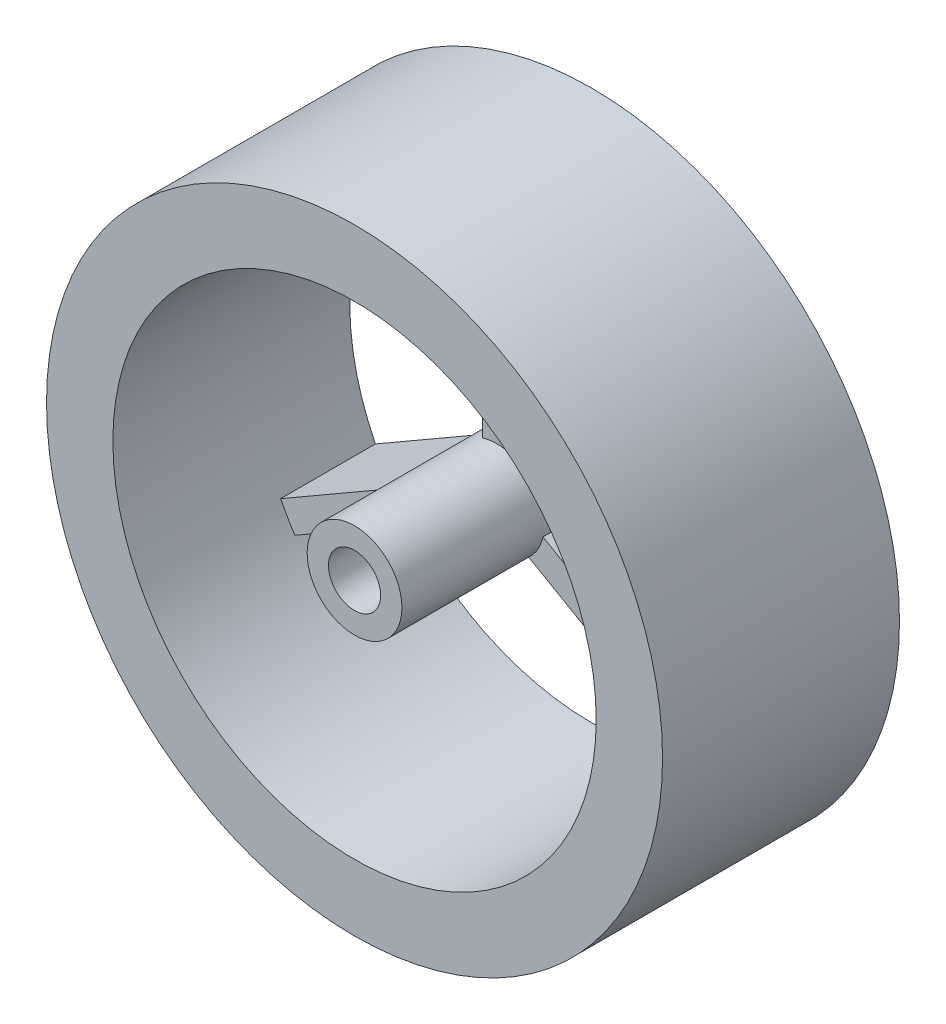
ISO-10303-21;
HEADER;
FILE_DESCRIPTION(('STEP AP214'),'2;1');
FILE_NAME('part.step','',(''),(''),'','','');
FILE_SCHEMA(('AUTOMOTIVE_DESIGN { 1 0 10303 214 1 1 1 1 }'));
ENDSEC;
DATA;
#1=APPLICATION_CONTEXT('core data for automotive mechanical design processes');
#2=APPLICATION_PROTOCOL_DEFINITION('international standard','automotive_design',2000,#1);
#3=PRODUCT_CONTEXT('',#1,'mechanical');
#4=PRODUCT('Part','Part','',(#3));
#5=PRODUCT_RELATED_PRODUCT_CATEGORY('part','',(#4));
#6=PRODUCT_DEFINITION_FORMATION('','',#4);
#7=PRODUCT_DEFINITION_CONTEXT('part definition',#1,'design');
#8=PRODUCT_DEFINITION('design','',#6,#7);
#9=PRODUCT_DEFINITION_SHAPE('','',#8);
#10=(LENGTH_UNIT() NAMED_UNIT(*) SI_UNIT(.MILLI.,.METRE.));
#11=(NAMED_UNIT(*) PLANE_ANGLE_UNIT() SI_UNIT($,.RADIAN.));
#12=(NAMED_UNIT(*) SI_UNIT($,.STERADIAN.) SOLID_ANGLE_UNIT());
#13=UNCERTAINTY_MEASURE_WITH_UNIT(LENGTH_MEASURE(1.E-05),#10,'distance_accuracy_value','');
#14=(GEOMETRIC_REPRESENTATION_CONTEXT(3) GLOBAL_UNCERTAINTY_ASSIGNED_CONTEXT((#13)) GLOBAL_UNIT_ASSIGNED_CONTEXT((#10,
#11,#12)) REPRESENTATION_CONTEXT('',''));
#15=CARTESIAN_POINT('',(0.,0.,0.));
#16=DIRECTION('',(0.,0.,1.));
#17=DIRECTION('',(1.,0.,0.));
#18=AXIS2_PLACEMENT_3D('',#15,#16,#17);
#19=CARTESIAN_POINT('',(0.,0.,25.));
#20=DIRECTION('',(0.,0.,-1.));
#21=DIRECTION('',(-1.,0.,0.));
#22=AXIS2_PLACEMENT_3D('',#19,#20,#21);
#23=CYLINDRICAL_SURFACE('',#22,25.5);
#24=CARTESIAN_POINT('',(0.,0.,25.));
#25=DIRECTION('',(0.,0.,1.));
#26=DIRECTION('',(1.,0.,0.));
#27=AXIS2_PLACEMENT_3D('',#24,#25,#26);
#28=CIRCLE('',#27,25.5);
#29=CARTESIAN_POINT('',(25.5,0.,25.));
#30=VERTEX_POINT('',#29);
#31=EDGE_CURVE('E247',#30,#30,#28,.T.);
#32=ORIENTED_EDGE('',*,*,#31,.T.);
#33=EDGE_LOOP('',(#32));
#34=FACE_BOUND('',#33,.T.);
#35=CARTESIAN_POINT('',(0.,0.,10.));
#36=DIRECTION('',(0.,0.,1.));
#37=DIRECTION('',(1.,0.,0.));
#38=AXIS2_PLACEMENT_3D('',#35,#36,#37);
#39=CIRCLE('',#38,25.5);
#40=CARTESIAN_POINT('',(21.2954076850486,-14.0269601670345,10.));
#41=VERTEX_POINT('',#40);
#42=CARTESIAN_POINT('',(22.7954076850486,-11.4288839556812,10.));
#43=VERTEX_POINT('',#42);
#44=EDGE_CURVE('E142',#41,#43,#39,.T.);
#45=ORIENTED_EDGE('',*,*,#44,.F.);
#46=DIRECTION('',(0.,0.,-1.));
#47=VECTOR('',#46,1.);
#48=CARTESIAN_POINT('',(21.2954076850486,-14.0269601670345,10.));
#49=LINE('',#48,#47);
#50=CARTESIAN_POINT('',(21.2954076850486,-14.0269601670345,0.));
#51=VERTEX_POINT('',#50);
#52=EDGE_CURVE('E173',#41,#51,#49,.T.);
#53=ORIENTED_EDGE('',*,*,#52,.T.);
#54=CARTESIAN_POINT('',(0.,0.,0.));
#55=DIRECTION('',(0.,0.,1.));
#56=DIRECTION('',(1.,0.,0.));
#57=AXIS2_PLACEMENT_3D('',#54,#55,#56);
#58=CIRCLE('',#57,25.5);
#59=CARTESIAN_POINT('',(-21.2954076850486,-14.0269601670345,0.));
#60=VERTEX_POINT('',#59);
#61=EDGE_CURVE('E254',#60,#51,#58,.T.);
#62=ORIENTED_EDGE('',*,*,#61,.F.);
#63=DIRECTION('',(0.,0.,-1.));
#64=VECTOR('',#63,1.);
#65=CARTESIAN_POINT('',(-21.2954076850486,-14.0269601670345,10.));
#66=LINE('',#65,#64);
#67=CARTESIAN_POINT('',(-21.2954076850486,-14.0269601670345,10.));
#68=VERTEX_POINT('',#67);
#69=EDGE_CURVE('E203',#68,#60,#66,.T.);
#70=ORIENTED_EDGE('',*,*,#69,.F.);
#71=CARTESIAN_POINT('',(0.,0.,10.));
#72=DIRECTION('',(0.,0.,1.));
#73=DIRECTION('',(1.,0.,0.));
#74=AXIS2_PLACEMENT_3D('',#71,#72,#73);
#75=CIRCLE('',#74,25.5);
#76=CARTESIAN_POINT('',(-22.7954076850486,-11.4288839556812,10.));
#77=VERTEX_POINT('',#76);
#78=EDGE_CURVE('E181',#77,#68,#75,.T.);
#79=ORIENTED_EDGE('',*,*,#78,.F.);
#80=DIRECTION('',(0.,0.,-1.));
#81=VECTOR('',#80,1.);
#82=CARTESIAN_POINT('',(-22.7954076850486,-11.4288839556812,10.));
#83=LINE('',#82,#81);
#84=CARTESIAN_POINT('',(-22.7954076850486,-11.4288839556812,0.));
#85=VERTEX_POINT('',#84);
#86=EDGE_CURVE('E206',#77,#85,#83,.T.);
#87=ORIENTED_EDGE('',*,*,#86,.T.);
#88=CARTESIAN_POINT('',(-1.5,25.4558441227157,0.));
#89=VERTEX_POINT('',#88);
#90=EDGE_CURVE('E251',#89,#85,#58,.T.);
#91=ORIENTED_EDGE('',*,*,#90,.F.);
#92=DIRECTION('',(0.,0.,-1.));
#93=VECTOR('',#92,1.);
#94=CARTESIAN_POINT('',(-1.5,25.4558441227157,10.));
#95=LINE('',#94,#93);
#96=CARTESIAN_POINT('',(-1.5,25.4558441227157,10.));
#97=VERTEX_POINT('',#96);
#98=EDGE_CURVE('E235',#97,#89,#95,.T.);
#99=ORIENTED_EDGE('',*,*,#98,.F.);
#100=CARTESIAN_POINT('',(0.,0.,10.));
#101=DIRECTION('',(0.,0.,1.));
#102=DIRECTION('',(1.,0.,0.));
#103=AXIS2_PLACEMENT_3D('',#100,#101,#102);
#104=CIRCLE('',#103,25.5);
#105=CARTESIAN_POINT('',(1.5,25.4558441227157,10.));
#106=VERTEX_POINT('',#105);
#107=EDGE_CURVE('E219',#106,#97,#104,.T.);
#108=ORIENTED_EDGE('',*,*,#107,.F.);
#109=DIRECTION('',(0.,0.,-1.));
#110=VECTOR('',#109,1.);
#111=CARTESIAN_POINT('',(1.5,25.4558441227157,10.));
#112=LINE('',#111,#110);
#113=CARTESIAN_POINT('',(1.5,25.4558441227157,0.));
#114=VERTEX_POINT('',#113);
#115=EDGE_CURVE('E239',#106,#114,#112,.T.);
#116=ORIENTED_EDGE('',*,*,#115,.T.);
#117=CARTESIAN_POINT('',(22.7954076850486,-11.4288839556812,0.));
#118=VERTEX_POINT('',#117);
#119=EDGE_CURVE('E246',#118,#114,#58,.T.);
#120=ORIENTED_EDGE('',*,*,#119,.F.);
#121=DIRECTION('',(0.,0.,-1.));
#122=VECTOR('',#121,1.);
#123=CARTESIAN_POINT('',(22.7954076850486,-11.4288839556812,10.));
#124=LINE('',#123,#122);
#125=EDGE_CURVE('E153',#43,#118,#124,.T.);
#126=ORIENTED_EDGE('',*,*,#125,.F.);
#127=EDGE_LOOP('',(#45,#53,#62,#70,#79,#87,#91,#99,#108,#116,#120,#126));
#128=FACE_BOUND('',#127,.T.);
#129=ADVANCED_FACE('F44',(#34,#128),#23,.F.);
#130=CARTESIAN_POINT('',(0.,0.,25.));
#131=DIRECTION('',(0.,0.,1.));
#132=DIRECTION('',(1.,0.,0.));
#133=AXIS2_PLACEMENT_3D('',#130,#131,#132);
#134=PLANE('',#133);
#135=CARTESIAN_POINT('',(0.,0.,25.));
#136=DIRECTION('',(0.,0.,1.));
#137=DIRECTION('',(1.,0.,0.));
#138=AXIS2_PLACEMENT_3D('',#135,#136,#137);
#139=CIRCLE('',#138,32.5);
#140=CARTESIAN_POINT('',(32.5,0.,25.));
#141=VERTEX_POINT('',#140);
#142=EDGE_CURVE('E11',#141,#141,#139,.T.);
#143=ORIENTED_EDGE('',*,*,#142,.T.);
#144=EDGE_LOOP('',(#143));
#145=FACE_BOUND('',#144,.T.);
#146=ORIENTED_EDGE('',*,*,#31,.F.);
#147=EDGE_LOOP('',(#146));
#148=FACE_BOUND('',#147,.T.);
#149=ADVANCED_FACE('F316',(#145,#148),#134,.T.);
#150=CARTESIAN_POINT('',(0.,0.,0.));
#151=DIRECTION('',(0.,0.,1.));
#152=DIRECTION('',(1.,0.,0.));
#153=AXIS2_PLACEMENT_3D('',#150,#151,#152);
#154=PLANE('',#153);
#155=CARTESIAN_POINT('',(0.,0.,0.));
#156=DIRECTION('',(0.,0.,1.));
#157=DIRECTION('',(1.,0.,0.));
#158=AXIS2_PLACEMENT_3D('',#155,#156,#157);
#159=CIRCLE('',#158,5.);
#160=CARTESIAN_POINT('',(-1.5,4.76969600708473,0.));
#161=VERTEX_POINT('',#160);
#162=CARTESIAN_POINT('',(-4.88067791046458,-1.08580989786571,0.));
#163=VERTEX_POINT('',#162);
#164=EDGE_CURVE('E283',#161,#163,#159,.T.);
#165=ORIENTED_EDGE('',*,*,#164,.F.);
#166=DIRECTION('',(0.,1.,0.));
#167=VECTOR('',#166,1.);
#168=CARTESIAN_POINT('',(-1.5,0.,0.));
#169=LINE('',#168,#167);
#170=EDGE_CURVE('E216',#161,#89,#169,.T.);
#171=ORIENTED_EDGE('',*,*,#170,.T.);
#172=ORIENTED_EDGE('',*,*,#90,.T.);
#173=DIRECTION('',(-0.866025403784438,-0.5,0.));
#174=VECTOR('',#173,1.);
#175=CARTESIAN_POINT('',(-0.750000000000001,1.29903810567666,0.));
#176=LINE('',#175,#174);
#177=EDGE_CURVE('E177',#163,#85,#176,.T.);
#178=ORIENTED_EDGE('',*,*,#177,.F.);
#179=EDGE_LOOP('',(#165,#171,#172,#178));
#180=FACE_BOUND('',#179,.T.);
#181=CARTESIAN_POINT('',(-3.38067791046457,-3.68388610921902,0.));
#182=VERTEX_POINT('',#181);
#183=CARTESIAN_POINT('',(3.38067791046458,-3.68388610921902,0.));
#184=VERTEX_POINT('',#183);
#185=EDGE_CURVE('E281',#182,#184,#159,.T.);
#186=ORIENTED_EDGE('',*,*,#185,.F.);
#187=DIRECTION('',(-0.866025403784438,-0.5,0.));
#188=VECTOR('',#187,1.);
#189=CARTESIAN_POINT('',(0.750000000000001,-1.29903810567666,0.));
#190=LINE('',#189,#188);
#191=EDGE_CURVE('E68',#182,#60,#190,.T.);
#192=ORIENTED_EDGE('',*,*,#191,.T.);
#193=ORIENTED_EDGE('',*,*,#61,.T.);
#194=DIRECTION('',(0.866025403784439,-0.5,0.));
#195=VECTOR('',#194,1.);
#196=CARTESIAN_POINT('',(-0.75,-1.29903810567666,0.));
#197=LINE('',#196,#195);
#198=EDGE_CURVE('E164',#184,#51,#197,.T.);
#199=ORIENTED_EDGE('',*,*,#198,.F.);
#200=EDGE_LOOP('',(#186,#192,#193,#199));
#201=FACE_BOUND('',#200,.T.);
#202=CARTESIAN_POINT('',(0.,0.,0.));
#203=DIRECTION('',(0.,0.,1.));
#204=DIRECTION('',(1.,0.,0.));
#205=AXIS2_PLACEMENT_3D('',#202,#203,#204);
#206=CIRCLE('',#205,32.5);
#207=CARTESIAN_POINT('',(32.5,0.,0.));
#208=VERTEX_POINT('',#207);
#209=EDGE_CURVE('E48',#208,#208,#206,.T.);
#210=ORIENTED_EDGE('',*,*,#209,.F.);
#211=EDGE_LOOP('',(#210));
#212=FACE_BOUND('',#211,.T.);
#213=DIRECTION('',(0.,1.,0.));
#214=VECTOR('',#213,1.);
#215=CARTESIAN_POINT('',(1.5,0.,0.));
#216=LINE('',#215,#214);
#217=CARTESIAN_POINT('',(1.5,4.76969600708473,0.));
#218=VERTEX_POINT('',#217);
#219=EDGE_CURVE('E210',#218,#114,#216,.T.);
#220=ORIENTED_EDGE('',*,*,#219,.F.);
#221=CARTESIAN_POINT('',(4.88067791046458,-1.0858098978657,0.));
#222=VERTEX_POINT('',#221);
#223=EDGE_CURVE('E279',#222,#218,#159,.T.);
#224=ORIENTED_EDGE('',*,*,#223,.F.);
#225=DIRECTION('',(0.866025403784439,-0.5,0.));
#226=VECTOR('',#225,1.);
#227=CARTESIAN_POINT('',(0.75,1.29903810567666,0.));
#228=LINE('',#227,#226);
#229=EDGE_CURVE('E60',#222,#118,#228,.T.);
#230=ORIENTED_EDGE('',*,*,#229,.T.);
#231=ORIENTED_EDGE('',*,*,#119,.T.);
#232=EDGE_LOOP('',(#220,#224,#230,#231));
#233=FACE_BOUND('',#232,.T.);
#234=CARTESIAN_POINT('',(0.,0.,0.));
#235=DIRECTION('',(0.,0.,1.));
#236=DIRECTION('',(1.,0.,0.));
#237=AXIS2_PLACEMENT_3D('',#234,#235,#236);
#238=CIRCLE('',#237,2.75);
#239=CARTESIAN_POINT('',(2.75,0.,0.));
#240=VERTEX_POINT('',#239);
#241=EDGE_CURVE('E288',#240,#240,#238,.T.);
#242=ORIENTED_EDGE('',*,*,#241,.T.);
#243=EDGE_LOOP('',(#242));
#244=FACE_BOUND('',#243,.T.);
#245=ADVANCED_FACE('F262',(#180,#201,#212,#233,#244),#154,.F.);
#246=CARTESIAN_POINT('',(0.,0.,25.));
#247=DIRECTION('',(0.,0.,-1.));
#248=DIRECTION('',(-1.,0.,0.));
#249=AXIS2_PLACEMENT_3D('',#246,#247,#248);
#250=CYLINDRICAL_SURFACE('',#249,32.5);
#251=ORIENTED_EDGE('',*,*,#142,.F.);
#252=EDGE_LOOP('',(#251));
#253=FACE_BOUND('',#252,.T.);
#254=ORIENTED_EDGE('',*,*,#209,.T.);
#255=EDGE_LOOP('',(#254));
#256=FACE_BOUND('',#255,.T.);
#257=ADVANCED_FACE('F46',(#253,#256),#250,.T.);
#258=CARTESIAN_POINT('',(1.5,0.,10.));
#259=DIRECTION('',(-1.,0.,0.));
#260=DIRECTION('',(0.,0.,1.));
#261=AXIS2_PLACEMENT_3D('',#258,#259,#260);
#262=PLANE('',#261);
#263=ORIENTED_EDGE('',*,*,#219,.T.);
#264=ORIENTED_EDGE('',*,*,#115,.F.);
#265=DIRECTION('',(0.,1.,0.));
#266=VECTOR('',#265,1.);
#267=CARTESIAN_POINT('',(1.5,0.,10.));
#268=LINE('',#267,#266);
#269=CARTESIAN_POINT('',(1.5,4.76969600708473,10.));
#270=VERTEX_POINT('',#269);
#271=EDGE_CURVE('E215',#270,#106,#268,.T.);
#272=ORIENTED_EDGE('',*,*,#271,.F.);
#273=DIRECTION('',(0.,0.,-1.));
#274=VECTOR('',#273,1.);
#275=CARTESIAN_POINT('',(1.5,4.76969600708473,10.));
#276=LINE('',#275,#274);
#277=EDGE_CURVE('E243',#270,#218,#276,.T.);
#278=ORIENTED_EDGE('',*,*,#277,.T.);
#279=EDGE_LOOP('',(#263,#264,#272,#278));
#280=FACE_BOUND('',#279,.T.);
#281=ADVANCED_FACE('F267',(#280),#262,.F.);
#282=CARTESIAN_POINT('',(-1.5,0.,10.));
#283=DIRECTION('',(-1.,0.,0.));
#284=DIRECTION('',(0.,0.,1.));
#285=AXIS2_PLACEMENT_3D('',#282,#283,#284);
#286=PLANE('',#285);
#287=ORIENTED_EDGE('',*,*,#170,.F.);
#288=DIRECTION('',(0.,0.,-1.));
#289=VECTOR('',#288,1.);
#290=CARTESIAN_POINT('',(-1.5,4.76969600708473,10.));
#291=LINE('',#290,#289);
#292=CARTESIAN_POINT('',(-1.5,4.76969600708473,10.));
#293=VERTEX_POINT('',#292);
#294=EDGE_CURVE('E226',#293,#161,#291,.T.);
#295=ORIENTED_EDGE('',*,*,#294,.F.);
#296=DIRECTION('',(0.,1.,0.));
#297=VECTOR('',#296,1.);
#298=CARTESIAN_POINT('',(-1.5,0.,10.));
#299=LINE('',#298,#297);
#300=EDGE_CURVE('E222',#293,#97,#299,.T.);
#301=ORIENTED_EDGE('',*,*,#300,.T.);
#302=ORIENTED_EDGE('',*,*,#98,.T.);
#303=EDGE_LOOP('',(#287,#295,#301,#302));
#304=FACE_BOUND('',#303,.T.);
#305=ADVANCED_FACE('F276',(#304),#286,.T.);
#306=CARTESIAN_POINT('',(0.,0.,10.));
#307=DIRECTION('',(0.,0.,1.));
#308=DIRECTION('',(1.,0.,0.));
#309=AXIS2_PLACEMENT_3D('',#306,#307,#308);
#310=PLANE('',#309);
#311=CARTESIAN_POINT('',(0.,0.,10.));
#312=DIRECTION('',(0.,0.,1.));
#313=DIRECTION('',(1.,0.,0.));
#314=AXIS2_PLACEMENT_3D('',#311,#312,#313);
#315=CIRCLE('',#314,5.);
#316=EDGE_CURVE('E211',#270,#293,#315,.T.);
#317=ORIENTED_EDGE('',*,*,#316,.F.);
#318=ORIENTED_EDGE('',*,*,#271,.T.);
#319=ORIENTED_EDGE('',*,*,#107,.T.);
#320=ORIENTED_EDGE('',*,*,#300,.F.);
#321=EDGE_LOOP('',(#317,#318,#319,#320));
#322=FACE_BOUND('',#321,.T.);
#323=ADVANCED_FACE('F273',(#322),#310,.T.);
#324=CARTESIAN_POINT('',(-0.750000000000001,1.29903810567666,10.));
#325=DIRECTION('',(0.5,-0.866025403784438,0.));
#326=DIRECTION('',(0.866025403784438,0.5,0.));
#327=AXIS2_PLACEMENT_3D('',#324,#325,#326);
#328=PLANE('',#327);
#329=ORIENTED_EDGE('',*,*,#177,.T.);
#330=ORIENTED_EDGE('',*,*,#86,.F.);
#331=DIRECTION('',(-0.866025403784438,-0.5,0.));
#332=VECTOR('',#331,1.);
#333=CARTESIAN_POINT('',(-0.750000000000001,1.29903810567666,10.));
#334=LINE('',#333,#332);
#335=CARTESIAN_POINT('',(-4.88067791046458,-1.08580989786571,10.));
#336=VERTEX_POINT('',#335);
#337=EDGE_CURVE('E178',#336,#77,#334,.T.);
#338=ORIENTED_EDGE('',*,*,#337,.F.);
#339=DIRECTION('',(0.,0.,-1.));
#340=VECTOR('',#339,1.);
#341=CARTESIAN_POINT('',(-4.88067791046458,-1.08580989786571,10.));
#342=LINE('',#341,#340);
#343=EDGE_CURVE('E192',#336,#163,#342,.T.);
#344=ORIENTED_EDGE('',*,*,#343,.T.);
#345=EDGE_LOOP('',(#329,#330,#338,#344));
#346=FACE_BOUND('',#345,.T.);
#347=ADVANCED_FACE('F361',(#346),#328,.F.);
#348=CARTESIAN_POINT('',(0.750000000000001,-1.29903810567666,10.));
#349=DIRECTION('',(0.5,-0.866025403784438,0.));
#350=DIRECTION('',(0.866025403784438,0.5,0.));
#351=AXIS2_PLACEMENT_3D('',#348,#349,#350);
#352=PLANE('',#351);
#353=ORIENTED_EDGE('',*,*,#191,.F.);
#354=DIRECTION('',(0.,0.,-1.));
#355=VECTOR('',#354,1.);
#356=CARTESIAN_POINT('',(-3.38067791046457,-3.68388610921902,10.));
#357=LINE('',#356,#355);
#358=CARTESIAN_POINT('',(-3.38067791046457,-3.68388610921902,10.));
#359=VERTEX_POINT('',#358);
#360=EDGE_CURVE('E199',#359,#182,#357,.T.);
#361=ORIENTED_EDGE('',*,*,#360,.F.);
#362=DIRECTION('',(-0.866025403784438,-0.5,0.));
#363=VECTOR('',#362,1.);
#364=CARTESIAN_POINT('',(0.750000000000001,-1.29903810567666,10.));
#365=LINE('',#364,#363);
#366=EDGE_CURVE('E184',#359,#68,#365,.T.);
#367=ORIENTED_EDGE('',*,*,#366,.T.);
#368=ORIENTED_EDGE('',*,*,#69,.T.);
#369=EDGE_LOOP('',(#353,#361,#367,#368));
#370=FACE_BOUND('',#369,.T.);
#371=ADVANCED_FACE('F340',(#370),#352,.T.);
#372=CARTESIAN_POINT('',(0.,0.,10.));
#373=DIRECTION('',(0.,0.,1.));
#374=DIRECTION('',(1.,0.,0.));
#375=AXIS2_PLACEMENT_3D('',#372,#373,#374);
#376=PLANE('',#375);
#377=ORIENTED_EDGE('',*,*,#337,.T.);
#378=ORIENTED_EDGE('',*,*,#78,.T.);
#379=ORIENTED_EDGE('',*,*,#366,.F.);
#380=CARTESIAN_POINT('',(0.,0.,10.));
#381=DIRECTION('',(0.,0.,1.));
#382=DIRECTION('',(1.,0.,0.));
#383=AXIS2_PLACEMENT_3D('',#380,#381,#382);
#384=CIRCLE('',#383,5.);
#385=EDGE_CURVE('E188',#336,#359,#384,.T.);
#386=ORIENTED_EDGE('',*,*,#385,.F.);
#387=EDGE_LOOP('',(#377,#378,#379,#386));
#388=FACE_BOUND('',#387,.T.);
#389=ADVANCED_FACE('F348',(#388),#376,.T.);
#390=CARTESIAN_POINT('',(-0.75,-1.29903810567666,10.));
#391=DIRECTION('',(0.5,0.866025403784439,0.));
#392=DIRECTION('',(-0.866025403784439,0.5,0.));
#393=AXIS2_PLACEMENT_3D('',#390,#391,#392);
#394=PLANE('',#393);
#395=ORIENTED_EDGE('',*,*,#198,.T.);
#396=ORIENTED_EDGE('',*,*,#52,.F.);
#397=DIRECTION('',(0.866025403784439,-0.5,0.));
#398=VECTOR('',#397,1.);
#399=CARTESIAN_POINT('',(-0.75,-1.29903810567666,10.));
#400=LINE('',#399,#398);
#401=CARTESIAN_POINT('',(3.38067791046458,-3.68388610921902,10.));
#402=VERTEX_POINT('',#401);
#403=EDGE_CURVE('E169',#402,#41,#400,.T.);
#404=ORIENTED_EDGE('',*,*,#403,.F.);
#405=DIRECTION('',(0.,0.,-1.));
#406=VECTOR('',#405,1.);
#407=CARTESIAN_POINT('',(3.38067791046458,-3.68388610921902,10.));
#408=LINE('',#407,#406);
#409=EDGE_CURVE('E154',#402,#184,#408,.T.);
#410=ORIENTED_EDGE('',*,*,#409,.T.);
#411=EDGE_LOOP('',(#395,#396,#404,#410));
#412=FACE_BOUND('',#411,.T.);
#413=ADVANCED_FACE('F346',(#412),#394,.F.);
#414=CARTESIAN_POINT('',(0.75,1.29903810567666,10.));
#415=DIRECTION('',(0.5,0.866025403784439,0.));
#416=DIRECTION('',(-0.866025403784439,0.5,0.));
#417=AXIS2_PLACEMENT_3D('',#414,#415,#416);
#418=PLANE('',#417);
#419=ORIENTED_EDGE('',*,*,#229,.F.);
#420=DIRECTION('',(0.,0.,-1.));
#421=VECTOR('',#420,1.);
#422=CARTESIAN_POINT('',(4.88067791046458,-1.0858098978657,10.));
#423=LINE('',#422,#421);
#424=CARTESIAN_POINT('',(4.88067791046458,-1.0858098978657,10.));
#425=VERTEX_POINT('',#424);
#426=EDGE_CURVE('E148',#425,#222,#423,.T.);
#427=ORIENTED_EDGE('',*,*,#426,.F.);
#428=DIRECTION('',(0.866025403784439,-0.5,0.));
#429=VECTOR('',#428,1.);
#430=CARTESIAN_POINT('',(0.75,1.29903810567666,10.));
#431=LINE('',#430,#429);
#432=EDGE_CURVE('E135',#425,#43,#431,.T.);
#433=ORIENTED_EDGE('',*,*,#432,.T.);
#434=ORIENTED_EDGE('',*,*,#125,.T.);
#435=EDGE_LOOP('',(#419,#427,#433,#434));
#436=FACE_BOUND('',#435,.T.);
#437=ADVANCED_FACE('F149',(#436),#418,.T.);
#438=CARTESIAN_POINT('',(0.,0.,10.));
#439=DIRECTION('',(0.,0.,1.));
#440=DIRECTION('',(1.,0.,0.));
#441=AXIS2_PLACEMENT_3D('',#438,#439,#440);
#442=PLANE('',#441);
#443=ORIENTED_EDGE('',*,*,#403,.T.);
#444=ORIENTED_EDGE('',*,*,#44,.T.);
#445=ORIENTED_EDGE('',*,*,#432,.F.);
#446=CARTESIAN_POINT('',(0.,0.,10.));
#447=DIRECTION('',(0.,0.,1.));
#448=DIRECTION('',(1.,0.,0.));
#449=AXIS2_PLACEMENT_3D('',#446,#447,#448);
#450=CIRCLE('',#449,5.);
#451=EDGE_CURVE('E139',#402,#425,#450,.T.);
#452=ORIENTED_EDGE('',*,*,#451,.F.);
#453=EDGE_LOOP('',(#443,#444,#445,#452));
#454=FACE_BOUND('',#453,.T.);
#455=ADVANCED_FACE('F137',(#454),#442,.T.);
#456=CARTESIAN_POINT('',(0.,0.,25.));
#457=DIRECTION('',(0.,0.,-1.));
#458=DIRECTION('',(-1.,0.,0.));
#459=AXIS2_PLACEMENT_3D('',#456,#457,#458);
#460=CYLINDRICAL_SURFACE('',#459,5.);
#461=CARTESIAN_POINT('',(0.,0.,25.));
#462=DIRECTION('',(0.,0.,1.));
#463=DIRECTION('',(1.,0.,0.));
#464=AXIS2_PLACEMENT_3D('',#461,#462,#463);
#465=CIRCLE('',#464,5.);
#466=CARTESIAN_POINT('',(5.,0.,25.));
#467=VERTEX_POINT('',#466);
#468=EDGE_CURVE('E292',#467,#467,#465,.T.);
#469=ORIENTED_EDGE('',*,*,#468,.F.);
#470=EDGE_LOOP('',(#469));
#471=FACE_BOUND('',#470,.T.);
#472=ORIENTED_EDGE('',*,*,#223,.T.);
#473=ORIENTED_EDGE('',*,*,#277,.F.);
#474=ORIENTED_EDGE('',*,*,#316,.T.);
#475=ORIENTED_EDGE('',*,*,#294,.T.);
#476=ORIENTED_EDGE('',*,*,#164,.T.);
#477=ORIENTED_EDGE('',*,*,#343,.F.);
#478=ORIENTED_EDGE('',*,*,#385,.T.);
#479=ORIENTED_EDGE('',*,*,#360,.T.);
#480=ORIENTED_EDGE('',*,*,#185,.T.);
#481=ORIENTED_EDGE('',*,*,#409,.F.);
#482=ORIENTED_EDGE('',*,*,#451,.T.);
#483=ORIENTED_EDGE('',*,*,#426,.T.);
#484=EDGE_LOOP('',(#472,#473,#474,#475,#476,#477,#478,#479,#480,#481,#482,#483));
#485=FACE_BOUND('',#484,.T.);
#486=ADVANCED_FACE('F156',(#471,#485),#460,.T.);
#487=CARTESIAN_POINT('',(0.,0.,25.));
#488=DIRECTION('',(0.,0.,-1.));
#489=DIRECTION('',(-1.,0.,0.));
#490=AXIS2_PLACEMENT_3D('',#487,#488,#489);
#491=CYLINDRICAL_SURFACE('',#490,2.75);
#492=CARTESIAN_POINT('',(0.,0.,25.));
#493=DIRECTION('',(0.,0.,1.));
#494=DIRECTION('',(1.,0.,0.));
#495=AXIS2_PLACEMENT_3D('',#492,#493,#494);
#496=CIRCLE('',#495,2.75);
#497=CARTESIAN_POINT('',(2.75,0.,25.));
#498=VERTEX_POINT('',#497);
#499=EDGE_CURVE('E167',#498,#498,#496,.T.);
#500=ORIENTED_EDGE('',*,*,#499,.T.);
#501=EDGE_LOOP('',(#500));
#502=FACE_BOUND('',#501,.T.);
#503=ORIENTED_EDGE('',*,*,#241,.F.);
#504=EDGE_LOOP('',(#503));
#505=FACE_BOUND('',#504,.T.);
#506=ADVANCED_FACE('F304',(#502,#505),#491,.F.);
#507=CARTESIAN_POINT('',(0.,0.,25.));
#508=DIRECTION('',(0.,0.,1.));
#509=DIRECTION('',(1.,0.,0.));
#510=AXIS2_PLACEMENT_3D('',#507,#508,#509);
#511=PLANE('',#510);
#512=ORIENTED_EDGE('',*,*,#468,.T.);
#513=EDGE_LOOP('',(#512));
#514=FACE_BOUND('',#513,.T.);
#515=ORIENTED_EDGE('',*,*,#499,.F.);
#516=EDGE_LOOP('',(#515));
#517=FACE_BOUND('',#516,.T.);
#518=ADVANCED_FACE('F307',(#514,#517),#511,.T.);
#519=CLOSED_SHELL('',(#129,#149,#245,#257,#281,#305,#323,#347,#371,#389,#413,#437,#455,#486,
#506,#518));
#520=MANIFOLD_SOLID_BREP('B2',#519);
#521=ADVANCED_BREP_SHAPE_REPRESENTATION('',(#18,#520),#14);
#522=SHAPE_DEFINITION_REPRESENTATION(#9,#521);
ENDSEC;
END-ISO-10303-21;
